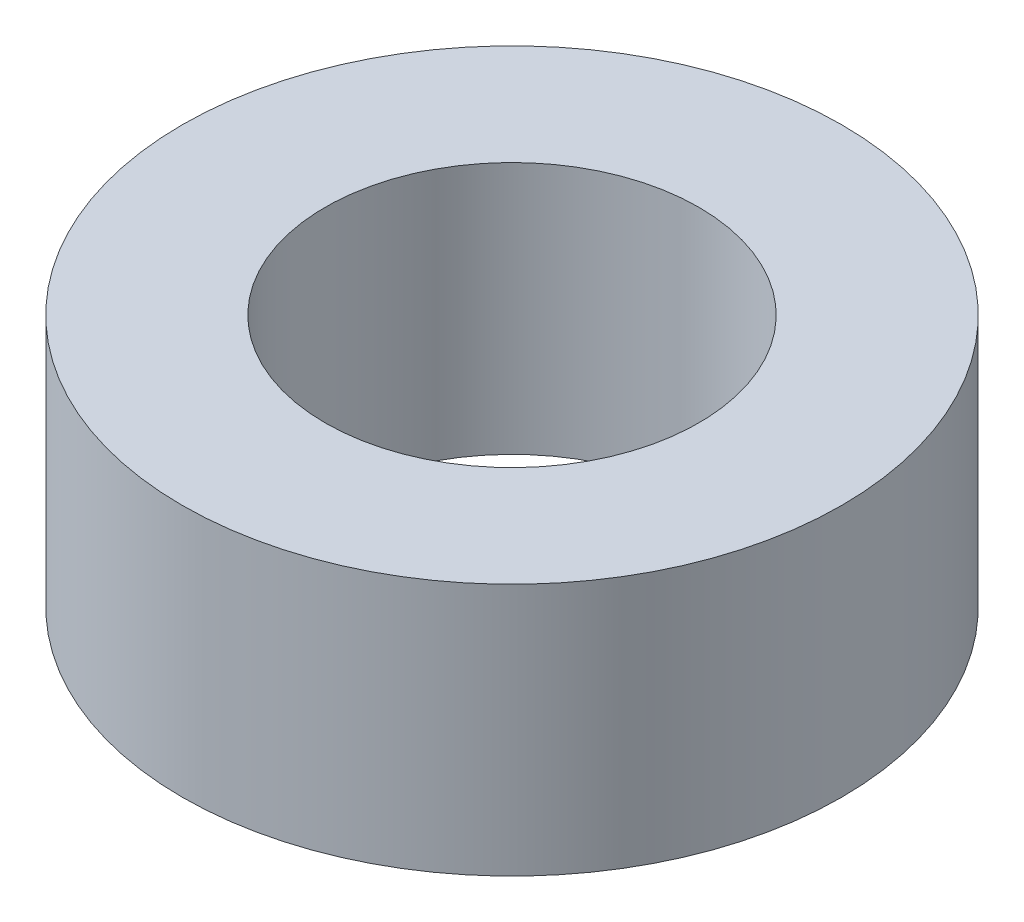
ISO-10303-21;
HEADER;
FILE_DESCRIPTION(('STEP AP214'),'2;1');
FILE_NAME('part.step','',(''),(''),'','','');
FILE_SCHEMA(('AUTOMOTIVE_DESIGN { 1 0 10303 214 1 1 1 1 }'));
ENDSEC;
DATA;
#1=APPLICATION_CONTEXT('core data for automotive mechanical design processes');
#2=APPLICATION_PROTOCOL_DEFINITION('international standard','automotive_design',2000,#1);
#3=PRODUCT_CONTEXT('',#1,'mechanical');
#4=PRODUCT('Part','Part','',(#3));
#5=PRODUCT_RELATED_PRODUCT_CATEGORY('part','',(#4));
#6=PRODUCT_DEFINITION_FORMATION('','',#4);
#7=PRODUCT_DEFINITION_CONTEXT('part definition',#1,'design');
#8=PRODUCT_DEFINITION('design','',#6,#7);
#9=PRODUCT_DEFINITION_SHAPE('','',#8);
#10=(LENGTH_UNIT() NAMED_UNIT(*) SI_UNIT(.MILLI.,.METRE.));
#11=(NAMED_UNIT(*) PLANE_ANGLE_UNIT() SI_UNIT($,.RADIAN.));
#12=(NAMED_UNIT(*) SI_UNIT($,.STERADIAN.) SOLID_ANGLE_UNIT());
#13=UNCERTAINTY_MEASURE_WITH_UNIT(LENGTH_MEASURE(1.E-05),#10,'distance_accuracy_value','');
#14=(GEOMETRIC_REPRESENTATION_CONTEXT(3) GLOBAL_UNCERTAINTY_ASSIGNED_CONTEXT((#13)) GLOBAL_UNIT_ASSIGNED_CONTEXT((#10,
#11,#12)) REPRESENTATION_CONTEXT('',''));
#15=CARTESIAN_POINT('',(0.,0.,0.));
#16=DIRECTION('',(0.,0.,1.));
#17=DIRECTION('',(1.,0.,0.));
#18=AXIS2_PLACEMENT_3D('',#15,#16,#17);
#19=CARTESIAN_POINT('',(0.,1.15,0.));
#20=DIRECTION('',(0.,1.,0.));
#21=DIRECTION('',(0.,0.,1.));
#22=AXIS2_PLACEMENT_3D('',#19,#20,#21);
#23=PLANE('',#22);
#24=CARTESIAN_POINT('',(0.,1.15,0.));
#25=DIRECTION('',(0.,1.,0.));
#26=DIRECTION('',(0.,0.,1.));
#27=AXIS2_PLACEMENT_3D('',#24,#25,#26);
#28=CIRCLE('',#27,3.);
#29=CARTESIAN_POINT('',(0.,1.15,3.));
#30=VERTEX_POINT('',#29);
#31=EDGE_CURVE('E10',#30,#30,#28,.T.);
#32=ORIENTED_EDGE('',*,*,#31,.T.);
#33=EDGE_LOOP('',(#32));
#34=FACE_BOUND('',#33,.T.);
#35=CARTESIAN_POINT('',(0.,1.15,0.));
#36=DIRECTION('',(0.,1.,0.));
#37=DIRECTION('',(0.,0.,1.));
#38=AXIS2_PLACEMENT_3D('',#35,#36,#37);
#39=CIRCLE('',#38,1.7);
#40=CARTESIAN_POINT('',(0.,1.15,1.7));
#41=VERTEX_POINT('',#40);
#42=EDGE_CURVE('E54',#41,#41,#39,.T.);
#43=ORIENTED_EDGE('',*,*,#42,.F.);
#44=EDGE_LOOP('',(#43));
#45=FACE_BOUND('',#44,.T.);
#46=ADVANCED_FACE('F41',(#34,#45),#23,.T.);
#47=CARTESIAN_POINT('',(0.,-1.15,0.));
#48=DIRECTION('',(0.,1.,0.));
#49=DIRECTION('',(0.,0.,1.));
#50=AXIS2_PLACEMENT_3D('',#47,#48,#49);
#51=PLANE('',#50);
#52=CARTESIAN_POINT('',(0.,-1.15,0.));
#53=DIRECTION('',(0.,1.,0.));
#54=DIRECTION('',(0.,0.,1.));
#55=AXIS2_PLACEMENT_3D('',#52,#53,#54);
#56=CIRCLE('',#55,3.);
#57=CARTESIAN_POINT('',(0.,-1.15,3.));
#58=VERTEX_POINT('',#57);
#59=EDGE_CURVE('E45',#58,#58,#56,.T.);
#60=ORIENTED_EDGE('',*,*,#59,.F.);
#61=EDGE_LOOP('',(#60));
#62=FACE_BOUND('',#61,.T.);
#63=CARTESIAN_POINT('',(0.,-1.15,0.));
#64=DIRECTION('',(0.,1.,0.));
#65=DIRECTION('',(0.,0.,1.));
#66=AXIS2_PLACEMENT_3D('',#63,#64,#65);
#67=CIRCLE('',#66,1.7);
#68=CARTESIAN_POINT('',(0.,-1.15,1.7));
#69=VERTEX_POINT('',#68);
#70=EDGE_CURVE('E56',#69,#69,#67,.T.);
#71=ORIENTED_EDGE('',*,*,#70,.T.);
#72=EDGE_LOOP('',(#71));
#73=FACE_BOUND('',#72,.T.);
#74=ADVANCED_FACE('F68',(#62,#73),#51,.F.);
#75=CARTESIAN_POINT('',(0.,1.15,0.));
#76=DIRECTION('',(0.,-1.,0.));
#77=DIRECTION('',(0.,0.,-1.));
#78=AXIS2_PLACEMENT_3D('',#75,#76,#77);
#79=CYLINDRICAL_SURFACE('',#78,3.);
#80=ORIENTED_EDGE('',*,*,#31,.F.);
#81=EDGE_LOOP('',(#80));
#82=FACE_BOUND('',#81,.T.);
#83=ORIENTED_EDGE('',*,*,#59,.T.);
#84=EDGE_LOOP('',(#83));
#85=FACE_BOUND('',#84,.T.);
#86=ADVANCED_FACE('F43',(#82,#85),#79,.T.);
#87=CARTESIAN_POINT('',(0.,1.15,0.));
#88=DIRECTION('',(0.,-1.,0.));
#89=DIRECTION('',(0.,0.,-1.));
#90=AXIS2_PLACEMENT_3D('',#87,#88,#89);
#91=CYLINDRICAL_SURFACE('',#90,1.7);
#92=ORIENTED_EDGE('',*,*,#42,.T.);
#93=EDGE_LOOP('',(#92));
#94=FACE_BOUND('',#93,.T.);
#95=ORIENTED_EDGE('',*,*,#70,.F.);
#96=EDGE_LOOP('',(#95));
#97=FACE_BOUND('',#96,.T.);
#98=ADVANCED_FACE('F64',(#94,#97),#91,.F.);
#99=CLOSED_SHELL('',(#46,#74,#86,#98));
#100=MANIFOLD_SOLID_BREP('B2',#99);
#101=ADVANCED_BREP_SHAPE_REPRESENTATION('',(#18,#100),#14);
#102=SHAPE_DEFINITION_REPRESENTATION(#9,#101);
ENDSEC;
END-ISO-10303-21;
